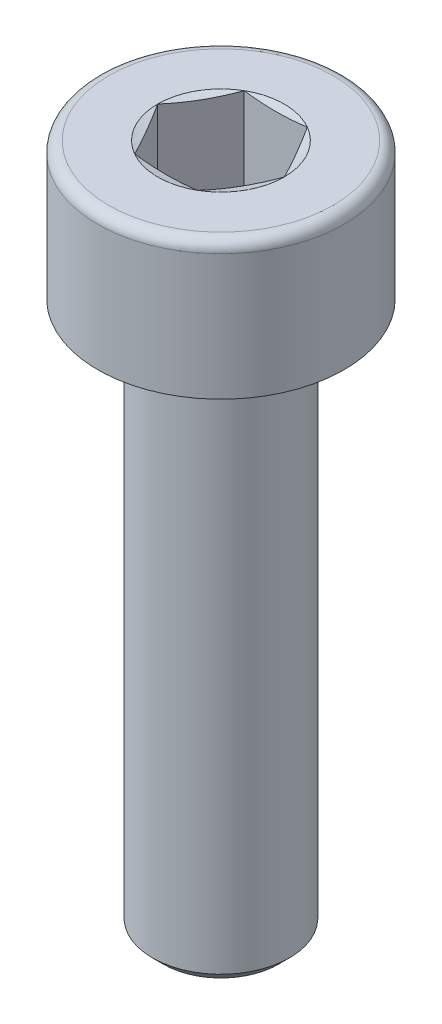
ISO-10303-21;
HEADER;
FILE_DESCRIPTION(('STEP AP214'),'2;1');
FILE_NAME('part.step','',(''),(''),'','','');
FILE_SCHEMA(('AUTOMOTIVE_DESIGN { 1 0 10303 214 1 1 1 1 }'));
ENDSEC;
DATA;
#1=APPLICATION_CONTEXT('core data for automotive mechanical design processes');
#2=APPLICATION_PROTOCOL_DEFINITION('international standard','automotive_design',2000,#1);
#3=PRODUCT_CONTEXT('',#1,'mechanical');
#4=PRODUCT('Part','Part','',(#3));
#5=PRODUCT_RELATED_PRODUCT_CATEGORY('part','',(#4));
#6=PRODUCT_DEFINITION_FORMATION('','',#4);
#7=PRODUCT_DEFINITION_CONTEXT('part definition',#1,'design');
#8=PRODUCT_DEFINITION('design','',#6,#7);
#9=PRODUCT_DEFINITION_SHAPE('','',#8);
#10=(LENGTH_UNIT() NAMED_UNIT(*) SI_UNIT(.MILLI.,.METRE.));
#11=(NAMED_UNIT(*) PLANE_ANGLE_UNIT() SI_UNIT($,.RADIAN.));
#12=(NAMED_UNIT(*) SI_UNIT($,.STERADIAN.) SOLID_ANGLE_UNIT());
#13=UNCERTAINTY_MEASURE_WITH_UNIT(LENGTH_MEASURE(1.E-05),#10,'distance_accuracy_value','');
#14=(GEOMETRIC_REPRESENTATION_CONTEXT(3) GLOBAL_UNCERTAINTY_ASSIGNED_CONTEXT((#13)) GLOBAL_UNIT_ASSIGNED_CONTEXT((#10,
#11,#12)) REPRESENTATION_CONTEXT('',''));
#15=CARTESIAN_POINT('',(0.,0.,0.));
#16=DIRECTION('',(0.,0.,1.));
#17=DIRECTION('',(1.,0.,0.));
#18=AXIS2_PLACEMENT_3D('',#15,#16,#17);
#19=CARTESIAN_POINT('',(-0.577350269189626,0.5,1.));
#20=DIRECTION('',(-0.866025403784439,0.,0.5));
#21=DIRECTION('',(0.5,0.,0.866025403784439));
#22=AXIS2_PLACEMENT_3D('',#19,#20,#21);
#23=PLANE('',#22);
#24=CARTESIAN_POINT('',(-0.577350269189626,2.5,1.));
#25=CARTESIAN_POINT('',(-0.602256905546369,2.4928156948734,0.956860440384478));
#26=CARTESIAN_POINT('',(-0.627233209396661,2.48665993251672,0.913600213130495));
#27=CARTESIAN_POINT('',(-0.677282869012061,2.47629629733561,0.826911659775093));
#28=CARTESIAN_POINT('',(-0.702356208114864,2.47208810385436,0.783483362533635));
#29=CARTESIAN_POINT('',(-0.777414647875531,2.46225168137474,0.653478331331313));
#30=CARTESIAN_POINT('',(-0.827492964204296,2.45934068378329,0.566740143092385));
#31=CARTESIAN_POINT('',(-0.923802752789168,2.46037348534467,0.399926695997169));
#32=CARTESIAN_POINT('',(-0.970035820593886,2.46381057241938,0.319848673569621));
#33=CARTESIAN_POINT('',(-1.03932177179707,2.47367744547349,0.199841885834972));
#34=CARTESIAN_POINT('',(-1.0624605054686,2.47776673103799,0.159764423493068));
#35=CARTESIAN_POINT('',(-1.10865304075022,2.48761182938245,0.0797566054548837));
#36=CARTESIAN_POINT('',(-1.13170682656885,2.49336793760975,0.0398262771102066));
#37=CARTESIAN_POINT('',(-1.15470053837925,2.5,0.));
#38=B_SPLINE_CURVE_WITH_KNOTS('',3,(#24,#25,#26,#27,#28,#29,#30,#31,#32,#33,#34,#35,#36,#37),
.UNSPECIFIED.,.F.,.F.,(4,2,2,2,2,2,4),(0.,0.150960283418929,0.3018957031821,0.602226966634645,
0.879613062899962,1.01895925678016,1.15833016516169),.UNSPECIFIED.);
#39=CARTESIAN_POINT('',(-0.577350269189627,2.5,0.999999999999998));
#40=VERTEX_POINT('',#39);
#41=CARTESIAN_POINT('',(-1.15470053837925,2.5,0.));
#42=VERTEX_POINT('',#41);
#43=EDGE_CURVE('E81',#40,#42,#38,.T.);
#44=ORIENTED_EDGE('',*,*,#43,.F.);
#45=DIRECTION('',(0.,1.,0.));
#46=VECTOR('',#45,1.);
#47=CARTESIAN_POINT('',(-0.577350269189626,0.5,1.));
#48=LINE('',#47,#46);
#49=CARTESIAN_POINT('',(-0.577350269189626,0.5,1.));
#50=VERTEX_POINT('',#49);
#51=EDGE_CURVE('E117',#40,#50,#48,.F.);
#52=ORIENTED_EDGE('',*,*,#51,.T.);
#53=DIRECTION('',(0.5,0.,0.866025403784439));
#54=VECTOR('',#53,1.);
#55=CARTESIAN_POINT('',(-0.577350269189626,0.5,1.));
#56=LINE('',#55,#54);
#57=CARTESIAN_POINT('',(-1.15470053837925,0.5,0.));
#58=VERTEX_POINT('',#57);
#59=EDGE_CURVE('E90',#58,#50,#56,.T.);
#60=ORIENTED_EDGE('',*,*,#59,.F.);
#61=DIRECTION('',(0.,1.,0.));
#62=VECTOR('',#61,1.);
#63=CARTESIAN_POINT('',(-1.15470053837925,0.5,0.));
#64=LINE('',#63,#62);
#65=EDGE_CURVE('E89',#58,#42,#64,.T.);
#66=ORIENTED_EDGE('',*,*,#65,.T.);
#67=EDGE_LOOP('',(#44,#52,#60,#66));
#68=FACE_BOUND('',#67,.T.);
#69=ADVANCED_FACE('F17',(#68),#23,.F.);
#70=CARTESIAN_POINT('',(-1.15470053837925,0.5,0.));
#71=DIRECTION('',(-0.866025403784439,0.,-0.5));
#72=DIRECTION('',(-0.5,0.,0.866025403784439));
#73=AXIS2_PLACEMENT_3D('',#70,#71,#72);
#74=PLANE('',#73);
#75=CARTESIAN_POINT('',(-1.15470053837925,2.5,0.));
#76=CARTESIAN_POINT('',(-1.12979390202251,2.4928156948734,-0.0431395596155221));
#77=CARTESIAN_POINT('',(-1.10481759817222,2.48665993251672,-0.0863997868695051));
#78=CARTESIAN_POINT('',(-1.05476793855682,2.47629629733561,-0.173088340224907));
#79=CARTESIAN_POINT('',(-1.02969459945401,2.47208810385436,-0.216516637466365));
#80=CARTESIAN_POINT('',(-0.954636159693347,2.46225168137474,-0.346521668668687));
#81=CARTESIAN_POINT('',(-0.904557843364581,2.45934068378329,-0.433259856907615));
#82=CARTESIAN_POINT('',(-0.808248054779709,2.46037348534467,-0.600073304002831));
#83=CARTESIAN_POINT('',(-0.762014986974991,2.46381057241938,-0.680151326430379));
#84=CARTESIAN_POINT('',(-0.69272903577181,2.47367744547349,-0.800158114165028));
#85=CARTESIAN_POINT('',(-0.669590302100275,2.47776673103799,-0.840235576506932));
#86=CARTESIAN_POINT('',(-0.623397766818654,2.48761182938245,-0.920243394545116));
#87=CARTESIAN_POINT('',(-0.600343981000025,2.49336793760975,-0.960173722889793));
#88=CARTESIAN_POINT('',(-0.577350269189626,2.5,-1.));
#89=B_SPLINE_CURVE_WITH_KNOTS('',3,(#75,#76,#77,#78,#79,#80,#81,#82,#83,#84,#85,#86,#87,#88),
.UNSPECIFIED.,.F.,.F.,(4,2,2,2,2,2,4),(0.,0.150960283418929,0.301895703182099,0.602226966634645,
0.879613062899962,1.01895925678016,1.15833016516169),.UNSPECIFIED.);
#90=CARTESIAN_POINT('',(-0.577350269189624,2.5,-1.));
#91=VERTEX_POINT('',#90);
#92=EDGE_CURVE('E96',#42,#91,#89,.T.);
#93=ORIENTED_EDGE('',*,*,#92,.F.);
#94=ORIENTED_EDGE('',*,*,#65,.F.);
#95=DIRECTION('',(0.5,0.,-0.866025403784439));
#96=VECTOR('',#95,1.);
#97=CARTESIAN_POINT('',(-1.15470053837925,0.5,0.));
#98=LINE('',#97,#96);
#99=CARTESIAN_POINT('',(-0.577350269189626,0.5,-1.));
#100=VERTEX_POINT('',#99);
#101=EDGE_CURVE('E228',#58,#100,#98,.T.);
#102=ORIENTED_EDGE('',*,*,#101,.T.);
#103=DIRECTION('',(0.,1.,0.));
#104=VECTOR('',#103,1.);
#105=CARTESIAN_POINT('',(-0.577350269189626,0.5,-1.));
#106=LINE('',#105,#104);
#107=EDGE_CURVE('E115',#100,#91,#106,.T.);
#108=ORIENTED_EDGE('',*,*,#107,.T.);
#109=EDGE_LOOP('',(#93,#94,#102,#108));
#110=FACE_BOUND('',#109,.T.);
#111=ADVANCED_FACE('F113',(#110),#74,.F.);
#112=CARTESIAN_POINT('',(0.577350269189626,0.5,1.));
#113=DIRECTION('',(0.,0.,1.));
#114=DIRECTION('',(1.,0.,0.));
#115=AXIS2_PLACEMENT_3D('',#112,#113,#114);
#116=PLANE('',#115);
#117=CARTESIAN_POINT('',(0.577350269189627,2.5,1.));
#118=CARTESIAN_POINT('',(0.52753699647614,2.4928156948734,1.));
#119=CARTESIAN_POINT('',(0.477584388775557,2.48665993251672,1.));
#120=CARTESIAN_POINT('',(0.377485069544756,2.47629629733561,1.));
#121=CARTESIAN_POINT('',(0.32733839133915,2.47208810385436,1.));
#122=CARTESIAN_POINT('',(0.177221511817818,2.46225168137474,1.));
#123=CARTESIAN_POINT('',(0.0770648791602864,2.45934068378329,0.999999999999999));
#124=CARTESIAN_POINT('',(-0.115554698009458,2.46037348534467,0.999999999999999));
#125=CARTESIAN_POINT('',(-0.208020833618895,2.46381057241937,1.));
#126=CARTESIAN_POINT('',(-0.346592736025259,2.47367744547348,1.));
#127=CARTESIAN_POINT('',(-0.392870203368329,2.47776673103799,1.));
#128=CARTESIAN_POINT('',(-0.48525527393157,2.48761182938245,1.));
#129=CARTESIAN_POINT('',(-0.531362845568829,2.49336793760975,1.));
#130=CARTESIAN_POINT('',(-0.577350269189626,2.5,1.));
#131=B_SPLINE_CURVE_WITH_KNOTS('',3,(#117,#118,#119,#120,#121,#122,#123,#124,#125,#126,#127,
#128,#129,#130),.UNSPECIFIED.,.F.,.F.,(4,2,2,2,2,2,4),(0.,0.150960283418929,0.3018957031821,
0.602226966634646,0.879613062899963,1.01895925678016,1.15833016516169),.UNSPECIFIED.);
#132=CARTESIAN_POINT('',(0.577350269189625,2.5,1.));
#133=VERTEX_POINT('',#132);
#134=EDGE_CURVE('E75',#133,#40,#131,.T.);
#135=ORIENTED_EDGE('',*,*,#134,.F.);
#136=DIRECTION('',(0.,1.,0.));
#137=VECTOR('',#136,1.);
#138=CARTESIAN_POINT('',(0.577350269189626,0.5,0.999999999999999));
#139=LINE('',#138,#137);
#140=CARTESIAN_POINT('',(0.577350269189626,0.5,0.999999999999999));
#141=VERTEX_POINT('',#140);
#142=EDGE_CURVE('E211',#133,#141,#139,.F.);
#143=ORIENTED_EDGE('',*,*,#142,.T.);
#144=DIRECTION('',(1.,0.,0.));
#145=VECTOR('',#144,1.);
#146=CARTESIAN_POINT('',(-0.577350269189626,0.5,1.));
#147=LINE('',#146,#145);
#148=EDGE_CURVE('E232',#141,#50,#147,.F.);
#149=ORIENTED_EDGE('',*,*,#148,.T.);
#150=ORIENTED_EDGE('',*,*,#51,.F.);
#151=EDGE_LOOP('',(#135,#143,#149,#150));
#152=FACE_BOUND('',#151,.T.);
#153=ADVANCED_FACE('F138',(#152),#116,.F.);
#154=CARTESIAN_POINT('',(-0.577350269189626,0.5,-1.));
#155=DIRECTION('',(0.,-1.,0.));
#156=DIRECTION('',(0.,0.,-1.));
#157=AXIS2_PLACEMENT_3D('',#154,#155,#156);
#158=PLANE('',#157);
#159=ORIENTED_EDGE('',*,*,#59,.T.);
#160=ORIENTED_EDGE('',*,*,#148,.F.);
#161=DIRECTION('',(0.5,0.,-0.866025403784439));
#162=VECTOR('',#161,1.);
#163=CARTESIAN_POINT('',(1.15470053837925,0.5,0.));
#164=LINE('',#163,#162);
#165=CARTESIAN_POINT('',(1.15470053837925,0.5,0.));
#166=VERTEX_POINT('',#165);
#167=EDGE_CURVE('E160',#141,#166,#164,.T.);
#168=ORIENTED_EDGE('',*,*,#167,.T.);
#169=DIRECTION('',(-0.5,0.,-0.866025403784439));
#170=VECTOR('',#169,1.);
#171=CARTESIAN_POINT('',(0.577350269189626,0.5,-1.));
#172=LINE('',#171,#170);
#173=CARTESIAN_POINT('',(0.577350269189626,0.5,-1.));
#174=VERTEX_POINT('',#173);
#175=EDGE_CURVE('E208',#166,#174,#172,.T.);
#176=ORIENTED_EDGE('',*,*,#175,.T.);
#177=DIRECTION('',(-1.,0.,0.));
#178=VECTOR('',#177,1.);
#179=CARTESIAN_POINT('',(-0.577350269189626,0.5,-1.));
#180=LINE('',#179,#178);
#181=EDGE_CURVE('E223',#174,#100,#180,.T.);
#182=ORIENTED_EDGE('',*,*,#181,.T.);
#183=ORIENTED_EDGE('',*,*,#101,.F.);
#184=EDGE_LOOP('',(#159,#160,#168,#176,#182,#183));
#185=FACE_BOUND('',#184,.T.);
#186=ADVANCED_FACE('F142',(#185),#158,.F.);
#187=CARTESIAN_POINT('',(-0.577350269189626,0.5,-1.));
#188=DIRECTION('',(0.,0.,-1.));
#189=DIRECTION('',(-1.,0.,0.));
#190=AXIS2_PLACEMENT_3D('',#187,#188,#189);
#191=PLANE('',#190);
#192=CARTESIAN_POINT('',(-0.577350269189626,2.5,-1.));
#193=CARTESIAN_POINT('',(-0.527536996476139,2.4928156948734,-1.));
#194=CARTESIAN_POINT('',(-0.477584388775556,2.48665993251672,-1.));
#195=CARTESIAN_POINT('',(-0.377485069544755,2.47629629733561,-1.));
#196=CARTESIAN_POINT('',(-0.327338391339149,2.47208810385436,-1.));
#197=CARTESIAN_POINT('',(-0.177221511817817,2.46225168137474,-1.));
#198=CARTESIAN_POINT('',(-0.0770648791602855,2.45934068378329,-0.999999999999999));
#199=CARTESIAN_POINT('',(0.115554698009459,2.46037348534467,-0.999999999999999));
#200=CARTESIAN_POINT('',(0.208020833618895,2.46381057241937,-1.));
#201=CARTESIAN_POINT('',(0.346592736025259,2.47367744547348,-1.));
#202=CARTESIAN_POINT('',(0.392870203368329,2.47776673103799,-1.));
#203=CARTESIAN_POINT('',(0.48525527393157,2.48761182938245,-1.));
#204=CARTESIAN_POINT('',(0.531362845568829,2.49336793760975,-1.));
#205=CARTESIAN_POINT('',(0.577350269189625,2.5,-1.));
#206=B_SPLINE_CURVE_WITH_KNOTS('',3,(#192,#193,#194,#195,#196,#197,#198,#199,#200,#201,#202,
#203,#204,#205),.UNSPECIFIED.,.F.,.F.,(4,2,2,2,2,2,4),(0.,0.150960283418929,0.3018957031821,
0.602226966634646,0.879613062899963,1.01895925678016,1.15833016516169),.UNSPECIFIED.);
#207=CARTESIAN_POINT('',(0.577350269189625,2.5,-1.));
#208=VERTEX_POINT('',#207);
#209=EDGE_CURVE('E155',#91,#208,#206,.T.);
#210=ORIENTED_EDGE('',*,*,#209,.F.);
#211=ORIENTED_EDGE('',*,*,#107,.F.);
#212=ORIENTED_EDGE('',*,*,#181,.F.);
#213=DIRECTION('',(0.,1.,0.));
#214=VECTOR('',#213,1.);
#215=CARTESIAN_POINT('',(0.577350269189626,0.5,-1.));
#216=LINE('',#215,#214);
#217=EDGE_CURVE('E203',#174,#208,#216,.T.);
#218=ORIENTED_EDGE('',*,*,#217,.T.);
#219=EDGE_LOOP('',(#210,#211,#212,#218));
#220=FACE_BOUND('',#219,.T.);
#221=ADVANCED_FACE('F146',(#220),#191,.F.);
#222=CARTESIAN_POINT('',(1.15470053837925,0.5,0.));
#223=DIRECTION('',(0.866025403784439,0.,0.5));
#224=DIRECTION('',(0.5,0.,-0.866025403784439));
#225=AXIS2_PLACEMENT_3D('',#222,#223,#224);
#226=PLANE('',#225);
#227=CARTESIAN_POINT('',(1.15470053837925,2.5,0.));
#228=CARTESIAN_POINT('',(1.12979390202251,2.4928156948734,0.0431395596155211));
#229=CARTESIAN_POINT('',(1.10481759817222,2.48665993251672,0.0863997868695041));
#230=CARTESIAN_POINT('',(1.05476793855682,2.47629629733561,0.173088340224906));
#231=CARTESIAN_POINT('',(1.02969459945401,2.47208810385436,0.216516637466364));
#232=CARTESIAN_POINT('',(0.954636159693348,2.46225168137474,0.346521668668686));
#233=CARTESIAN_POINT('',(0.904557843364581,2.45934068378329,0.433259856907614));
#234=CARTESIAN_POINT('',(0.808248054779709,2.46037348534467,0.60007330400283));
#235=CARTESIAN_POINT('',(0.762014986974991,2.46381057241937,0.680151326430379));
#236=CARTESIAN_POINT('',(0.69272903577181,2.47367744547348,0.800158114165028));
#237=CARTESIAN_POINT('',(0.669590302100275,2.47776673103799,0.840235576506931));
#238=CARTESIAN_POINT('',(0.623397766818654,2.48761182938245,0.920243394545116));
#239=CARTESIAN_POINT('',(0.600343981000025,2.49336793760975,0.960173722889793));
#240=CARTESIAN_POINT('',(0.577350269189626,2.5,0.999999999999999));
#241=B_SPLINE_CURVE_WITH_KNOTS('',3,(#227,#228,#229,#230,#231,#232,#233,#234,#235,#236,#237,
#238,#239,#240),.UNSPECIFIED.,.F.,.F.,(4,2,2,2,2,2,4),(0.,0.150960283418929,0.3018957031821,
0.602226966634646,0.879613062899963,1.01895925678016,1.15833016516169),.UNSPECIFIED.);
#242=CARTESIAN_POINT('',(1.15470053837925,2.5,0.));
#243=VERTEX_POINT('',#242);
#244=EDGE_CURVE('E161',#243,#133,#241,.T.);
#245=ORIENTED_EDGE('',*,*,#244,.F.);
#246=DIRECTION('',(0.,1.,0.));
#247=VECTOR('',#246,1.);
#248=CARTESIAN_POINT('',(1.15470053837925,0.5,0.));
#249=LINE('',#248,#247);
#250=EDGE_CURVE('E199',#243,#166,#249,.F.);
#251=ORIENTED_EDGE('',*,*,#250,.T.);
#252=ORIENTED_EDGE('',*,*,#167,.F.);
#253=ORIENTED_EDGE('',*,*,#142,.F.);
#254=EDGE_LOOP('',(#245,#251,#252,#253));
#255=FACE_BOUND('',#254,.T.);
#256=ADVANCED_FACE('F151',(#255),#226,.F.);
#257=CARTESIAN_POINT('',(0.577350269189626,0.5,-1.));
#258=DIRECTION('',(0.866025403784439,0.,-0.5));
#259=DIRECTION('',(-0.5,0.,-0.866025403784439));
#260=AXIS2_PLACEMENT_3D('',#257,#258,#259);
#261=PLANE('',#260);
#262=CARTESIAN_POINT('',(1.15470053837925,2.5,0.));
#263=CARTESIAN_POINT('',(1.12979390202251,2.4928156948734,-0.0431395596155228));
#264=CARTESIAN_POINT('',(1.10481759817222,2.48665993251672,-0.0863997868695059));
#265=CARTESIAN_POINT('',(1.05476793855682,2.47629629733561,-0.173088340224908));
#266=CARTESIAN_POINT('',(1.02969459945401,2.47208810385436,-0.216516637466366));
#267=CARTESIAN_POINT('',(0.954636159693346,2.46225168137474,-0.346521668668688));
#268=CARTESIAN_POINT('',(0.904557843364581,2.45934068378329,-0.433259856907616));
#269=CARTESIAN_POINT('',(0.808248054779709,2.46037348534467,-0.600073304002832));
#270=CARTESIAN_POINT('',(0.762014986974991,2.46381057241938,-0.68015132643038));
#271=CARTESIAN_POINT('',(0.692729035771809,2.47367744547349,-0.800158114165029));
#272=CARTESIAN_POINT('',(0.669590302100274,2.47776673103799,-0.840235576506932));
#273=CARTESIAN_POINT('',(0.623397766818654,2.48761182938245,-0.920243394545117));
#274=CARTESIAN_POINT('',(0.600343981000024,2.49336793760975,-0.960173722889794));
#275=CARTESIAN_POINT('',(0.577350269189626,2.5,-1.));
#276=B_SPLINE_CURVE_WITH_KNOTS('',3,(#262,#263,#264,#265,#266,#267,#268,#269,#270,#271,#272,
#273,#274,#275),.UNSPECIFIED.,.F.,.F.,(4,2,2,2,2,2,4),(0.,0.150960283418929,0.3018957031821,
0.602226966634645,0.879613062899962,1.01895925678016,1.15833016516169),.UNSPECIFIED.);
#277=EDGE_CURVE('E202',#243,#208,#276,.T.);
#278=ORIENTED_EDGE('',*,*,#277,.T.);
#279=ORIENTED_EDGE('',*,*,#217,.F.);
#280=ORIENTED_EDGE('',*,*,#175,.F.);
#281=ORIENTED_EDGE('',*,*,#250,.F.);
#282=EDGE_LOOP('',(#278,#279,#280,#281));
#283=FACE_BOUND('',#282,.T.);
#284=ADVANCED_FACE('F194',(#283),#261,.F.);
#285=CARTESIAN_POINT('',(-0.323386652483568,5.38251924939228,0.));
#286=DIRECTION('',(0.,0.,1.));
#287=DIRECTION('',(-1.,0.,0.));
#288=AXIS2_PLACEMENT_3D('',#285,#286,#287);
#289=CIRCLE('',#288,3.);
#290=TRIMMED_CURVE('',#289,(PARAMETER_VALUE(-1.67880173874616)),
(PARAMETER_VALUE(1.67880173874616)),.T.,.PARAMETER.);
#291=CARTESIAN_POINT('',(0.,5.38251924939228,0.));
#292=DIRECTION('',(0.,1.,0.));
#293=AXIS1_PLACEMENT('',#291,#292);
#294=SURFACE_OF_REVOLUTION('',#290,#293);
#295=ORIENTED_EDGE('',*,*,#244,.T.);
#296=CARTESIAN_POINT('',(0.,2.5,0.));
#297=DIRECTION('',(0.,1.,0.));
#298=DIRECTION('',(-1.,0.,0.));
#299=AXIS2_PLACEMENT_3D('',#296,#297,#298);
#300=CIRCLE('',#299,1.15470053837925);
#301=EDGE_CURVE('E259',#243,#133,#300,.F.);
#302=ORIENTED_EDGE('',*,*,#301,.F.);
#303=EDGE_LOOP('',(#295,#302));
#304=FACE_BOUND('',#303,.T.);
#305=ADVANCED_FACE('F191',(#304),#294,.T.);
#306=CARTESIAN_POINT('',(-0.323386652483568,5.38251924939228,0.));
#307=DIRECTION('',(0.,0.,1.));
#308=DIRECTION('',(-1.,0.,0.));
#309=AXIS2_PLACEMENT_3D('',#306,#307,#308);
#310=CIRCLE('',#309,3.);
#311=TRIMMED_CURVE('',#310,(PARAMETER_VALUE(-1.67880173874616)),
(PARAMETER_VALUE(1.67880173874616)),.T.,.PARAMETER.);
#312=CARTESIAN_POINT('',(0.,5.38251924939228,0.));
#313=DIRECTION('',(0.,1.,0.));
#314=AXIS1_PLACEMENT('',#312,#313);
#315=SURFACE_OF_REVOLUTION('',#311,#314);
#316=ORIENTED_EDGE('',*,*,#134,.T.);
#317=CARTESIAN_POINT('',(0.,2.5,0.));
#318=DIRECTION('',(0.,1.,0.));
#319=DIRECTION('',(-1.,0.,0.));
#320=AXIS2_PLACEMENT_3D('',#317,#318,#319);
#321=CIRCLE('',#320,1.15470053837925);
#322=EDGE_CURVE('E106',#133,#40,#321,.F.);
#323=ORIENTED_EDGE('',*,*,#322,.F.);
#324=EDGE_LOOP('',(#316,#323));
#325=FACE_BOUND('',#324,.T.);
#326=ADVANCED_FACE('F188',(#325),#315,.T.);
#327=CARTESIAN_POINT('',(-0.323386652483568,5.38251924939228,0.));
#328=DIRECTION('',(0.,0.,1.));
#329=DIRECTION('',(-1.,0.,0.));
#330=AXIS2_PLACEMENT_3D('',#327,#328,#329);
#331=CIRCLE('',#330,3.);
#332=TRIMMED_CURVE('',#331,(PARAMETER_VALUE(-1.67880173874616)),
(PARAMETER_VALUE(1.67880173874616)),.T.,.PARAMETER.);
#333=CARTESIAN_POINT('',(0.,5.38251924939228,0.));
#334=DIRECTION('',(0.,1.,0.));
#335=AXIS1_PLACEMENT('',#333,#334);
#336=SURFACE_OF_REVOLUTION('',#332,#335);
#337=ORIENTED_EDGE('',*,*,#43,.T.);
#338=CARTESIAN_POINT('',(0.,2.5,0.));
#339=DIRECTION('',(0.,1.,0.));
#340=DIRECTION('',(-1.,0.,0.));
#341=AXIS2_PLACEMENT_3D('',#338,#339,#340);
#342=CIRCLE('',#341,1.15470053837925);
#343=EDGE_CURVE('E85',#40,#42,#342,.F.);
#344=ORIENTED_EDGE('',*,*,#343,.F.);
#345=EDGE_LOOP('',(#337,#344));
#346=FACE_BOUND('',#345,.T.);
#347=ADVANCED_FACE('F83',(#346),#336,.T.);
#348=CARTESIAN_POINT('',(-0.323386652483568,5.38251924939228,0.));
#349=DIRECTION('',(0.,0.,1.));
#350=DIRECTION('',(-1.,0.,0.));
#351=AXIS2_PLACEMENT_3D('',#348,#349,#350);
#352=CIRCLE('',#351,3.);
#353=TRIMMED_CURVE('',#352,(PARAMETER_VALUE(-1.67880173874616)),
(PARAMETER_VALUE(1.67880173874616)),.T.,.PARAMETER.);
#354=CARTESIAN_POINT('',(0.,5.38251924939228,0.));
#355=DIRECTION('',(0.,1.,0.));
#356=AXIS1_PLACEMENT('',#354,#355);
#357=SURFACE_OF_REVOLUTION('',#353,#356);
#358=ORIENTED_EDGE('',*,*,#92,.T.);
#359=CARTESIAN_POINT('',(0.,2.5,0.));
#360=DIRECTION('',(0.,1.,0.));
#361=DIRECTION('',(-1.,0.,0.));
#362=AXIS2_PLACEMENT_3D('',#359,#360,#361);
#363=CIRCLE('',#362,1.15470053837925);
#364=EDGE_CURVE('E103',#42,#91,#363,.F.);
#365=ORIENTED_EDGE('',*,*,#364,.F.);
#366=EDGE_LOOP('',(#358,#365));
#367=FACE_BOUND('',#366,.T.);
#368=ADVANCED_FACE('F109',(#367),#357,.T.);
#369=CARTESIAN_POINT('',(-0.323386652483568,5.38251924939228,0.));
#370=DIRECTION('',(0.,0.,1.));
#371=DIRECTION('',(-1.,0.,0.));
#372=AXIS2_PLACEMENT_3D('',#369,#370,#371);
#373=CIRCLE('',#372,3.);
#374=TRIMMED_CURVE('',#373,(PARAMETER_VALUE(-1.67880173874616)),
(PARAMETER_VALUE(1.67880173874616)),.T.,.PARAMETER.);
#375=CARTESIAN_POINT('',(0.,5.38251924939228,0.));
#376=DIRECTION('',(0.,1.,0.));
#377=AXIS1_PLACEMENT('',#375,#376);
#378=SURFACE_OF_REVOLUTION('',#374,#377);
#379=ORIENTED_EDGE('',*,*,#209,.T.);
#380=CARTESIAN_POINT('',(0.,2.5,0.));
#381=DIRECTION('',(0.,1.,0.));
#382=DIRECTION('',(-1.,0.,0.));
#383=AXIS2_PLACEMENT_3D('',#380,#381,#382);
#384=CIRCLE('',#383,1.15470053837925);
#385=EDGE_CURVE('E111',#91,#208,#384,.F.);
#386=ORIENTED_EDGE('',*,*,#385,.F.);
#387=EDGE_LOOP('',(#379,#386));
#388=FACE_BOUND('',#387,.T.);
#389=ADVANCED_FACE('F167',(#388),#378,.T.);
#390=CARTESIAN_POINT('',(-0.323386652483568,5.38251924939228,0.));
#391=DIRECTION('',(0.,0.,1.));
#392=DIRECTION('',(-1.,0.,0.));
#393=AXIS2_PLACEMENT_3D('',#390,#391,#392);
#394=CIRCLE('',#393,3.);
#395=TRIMMED_CURVE('',#394,(PARAMETER_VALUE(-1.67880173874616)),
(PARAMETER_VALUE(1.67880173874616)),.T.,.PARAMETER.);
#396=CARTESIAN_POINT('',(0.,5.38251924939228,0.));
#397=DIRECTION('',(0.,1.,0.));
#398=AXIS1_PLACEMENT('',#396,#397);
#399=SURFACE_OF_REVOLUTION('',#395,#398);
#400=ORIENTED_EDGE('',*,*,#277,.F.);
#401=CARTESIAN_POINT('',(0.,2.5,0.));
#402=DIRECTION('',(0.,1.,0.));
#403=DIRECTION('',(-1.,0.,0.));
#404=AXIS2_PLACEMENT_3D('',#401,#402,#403);
#405=CIRCLE('',#404,1.15470053837925);
#406=EDGE_CURVE('E254',#208,#243,#405,.F.);
#407=ORIENTED_EDGE('',*,*,#406,.F.);
#408=EDGE_LOOP('',(#400,#407));
#409=FACE_BOUND('',#408,.T.);
#410=ADVANCED_FACE('F172',(#409),#399,.T.);
#411=CARTESIAN_POINT('',(0.,2.5,0.));
#412=DIRECTION('',(0.,1.,0.));
#413=DIRECTION('',(0.,0.,1.));
#414=AXIS2_PLACEMENT_3D('',#411,#412,#413);
#415=PLANE('',#414);
#416=CARTESIAN_POINT('',(0.,2.5,0.));
#417=DIRECTION('',(0.,-1.,0.));
#418=DIRECTION('',(0.,0.,-1.));
#419=AXIS2_PLACEMENT_3D('',#416,#417,#418);
#420=CIRCLE('',#419,2.05);
#421=CARTESIAN_POINT('',(0.,2.5,-2.05));
#422=VERTEX_POINT('',#421);
#423=CARTESIAN_POINT('',(0.,2.5,2.05));
#424=VERTEX_POINT('',#423);
#425=EDGE_CURVE('E37',#422,#424,#420,.T.);
#426=ORIENTED_EDGE('',*,*,#425,.F.);
#427=CARTESIAN_POINT('',(0.,2.5,0.));
#428=DIRECTION('',(0.,-1.,0.));
#429=DIRECTION('',(0.,0.,1.));
#430=AXIS2_PLACEMENT_3D('',#427,#428,#429);
#431=CIRCLE('',#430,2.05);
#432=EDGE_CURVE('E327',#424,#422,#431,.T.);
#433=ORIENTED_EDGE('',*,*,#432,.F.);
#434=EDGE_LOOP('',(#426,#433));
#435=FACE_BOUND('',#434,.T.);
#436=ORIENTED_EDGE('',*,*,#385,.T.);
#437=ORIENTED_EDGE('',*,*,#406,.T.);
#438=ORIENTED_EDGE('',*,*,#301,.T.);
#439=ORIENTED_EDGE('',*,*,#322,.T.);
#440=ORIENTED_EDGE('',*,*,#343,.T.);
#441=ORIENTED_EDGE('',*,*,#364,.T.);
#442=EDGE_LOOP('',(#436,#437,#438,#439,#440,#441));
#443=FACE_BOUND('',#442,.T.);
#444=ADVANCED_FACE('F102',(#435,#443),#415,.T.);
#445=CARTESIAN_POINT('',(0.,2.3,0.));
#446=DIRECTION('',(0.,1.,0.));
#447=DIRECTION('',(0.,0.,1.));
#448=AXIS2_PLACEMENT_3D('',#445,#446,#447);
#449=TOROIDAL_SURFACE('',#448,2.05,0.2);
#450=CARTESIAN_POINT('',(0.,2.3,0.));
#451=DIRECTION('',(0.,-1.,0.));
#452=DIRECTION('',(0.,0.,-1.));
#453=AXIS2_PLACEMENT_3D('',#450,#451,#452);
#454=CIRCLE('',#453,2.25);
#455=CARTESIAN_POINT('',(0.,2.3,-2.25));
#456=VERTEX_POINT('',#455);
#457=EDGE_CURVE('E253',#456,#456,#454,.T.);
#458=ORIENTED_EDGE('',*,*,#457,.F.);
#459=EDGE_LOOP('',(#458));
#460=FACE_BOUND('',#459,.T.);
#461=ORIENTED_EDGE('',*,*,#432,.T.);
#462=ORIENTED_EDGE('',*,*,#425,.T.);
#463=EDGE_LOOP('',(#461,#462));
#464=FACE_BOUND('',#463,.T.);
#465=ADVANCED_FACE('F304',(#460,#464),#449,.T.);
#466=CARTESIAN_POINT('',(0.,-10.,0.));
#467=DIRECTION('',(0.,-1.,0.));
#468=DIRECTION('',(0.,0.,-1.));
#469=AXIS2_PLACEMENT_3D('',#466,#467,#468);
#470=PLANE('',#469);
#471=CARTESIAN_POINT('',(0.,-9.99999999999091,0.));
#472=DIRECTION('',(0.,1.,0.));
#473=DIRECTION('',(0.,0.,1.));
#474=AXIS2_PLACEMENT_3D('',#471,#472,#473);
#475=CIRCLE('',#474,1.05000000007749);
#476=CARTESIAN_POINT('',(0.,-9.99999999999091,1.05000000007749));
#477=VERTEX_POINT('',#476);
#478=EDGE_CURVE('E250',#477,#477,#475,.T.);
#479=ORIENTED_EDGE('',*,*,#478,.F.);
#480=EDGE_LOOP('',(#479));
#481=FACE_BOUND('',#480,.T.);
#482=ADVANCED_FACE('F301',(#481),#470,.T.);
#483=CARTESIAN_POINT('',(0.,2.5,0.));
#484=DIRECTION('',(0.,-1.,0.));
#485=DIRECTION('',(0.,0.,-1.));
#486=AXIS2_PLACEMENT_3D('',#483,#484,#485);
#487=CYLINDRICAL_SURFACE('',#486,2.25);
#488=ORIENTED_EDGE('',*,*,#457,.T.);
#489=EDGE_LOOP('',(#488));
#490=FACE_BOUND('',#489,.T.);
#491=CARTESIAN_POINT('',(0.,0.,0.));
#492=DIRECTION('',(0.,-1.,0.));
#493=DIRECTION('',(0.,0.,-1.));
#494=AXIS2_PLACEMENT_3D('',#491,#492,#493);
#495=CIRCLE('',#494,2.25);
#496=CARTESIAN_POINT('',(0.,0.,-2.25));
#497=VERTEX_POINT('',#496);
#498=EDGE_CURVE('E247',#497,#497,#495,.F.);
#499=ORIENTED_EDGE('',*,*,#498,.T.);
#500=EDGE_LOOP('',(#499));
#501=FACE_BOUND('',#500,.T.);
#502=ADVANCED_FACE('F297',(#490,#501),#487,.T.);
#503=CARTESIAN_POINT('',(0.,-9.80000000004111,0.));
#504=DIRECTION('',(0.,1.,0.));
#505=DIRECTION('',(0.,0.,1.));
#506=AXIS2_PLACEMENT_3D('',#503,#504,#505);
#507=CONICAL_SURFACE('',#506,1.25000000002728,0.785398163397448);
#508=CARTESIAN_POINT('',(0.,-9.8,0.));
#509=DIRECTION('',(0.,1.,0.));
#510=DIRECTION('',(0.,0.,1.));
#511=AXIS2_PLACEMENT_3D('',#508,#509,#510);
#512=CIRCLE('',#511,1.25);
#513=CARTESIAN_POINT('',(0.,-9.8,1.25));
#514=VERTEX_POINT('',#513);
#515=EDGE_CURVE('E29',#514,#514,#512,.T.);
#516=ORIENTED_EDGE('',*,*,#515,.F.);
#517=EDGE_LOOP('',(#516));
#518=FACE_BOUND('',#517,.T.);
#519=ORIENTED_EDGE('',*,*,#478,.T.);
#520=EDGE_LOOP('',(#519));
#521=FACE_BOUND('',#520,.T.);
#522=ADVANCED_FACE('F290',(#518,#521),#507,.T.);
#523=CARTESIAN_POINT('',(0.,0.,0.));
#524=DIRECTION('',(0.,1.,0.));
#525=DIRECTION('',(0.,0.,1.));
#526=AXIS2_PLACEMENT_3D('',#523,#524,#525);
#527=PLANE('',#526);
#528=CARTESIAN_POINT('',(0.,0.,0.));
#529=DIRECTION('',(0.,1.,0.));
#530=DIRECTION('',(0.,0.,1.));
#531=AXIS2_PLACEMENT_3D('',#528,#529,#530);
#532=CIRCLE('',#531,1.25);
#533=CARTESIAN_POINT('',(0.,0.,1.25));
#534=VERTEX_POINT('',#533);
#535=EDGE_CURVE('E11',#534,#534,#532,.F.);
#536=ORIENTED_EDGE('',*,*,#535,.F.);
#537=EDGE_LOOP('',(#536));
#538=FACE_BOUND('',#537,.T.);
#539=ORIENTED_EDGE('',*,*,#498,.F.);
#540=EDGE_LOOP('',(#539));
#541=FACE_BOUND('',#540,.T.);
#542=ADVANCED_FACE('F284',(#538,#541),#527,.F.);
#543=CARTESIAN_POINT('',(0.,-10.,0.));
#544=DIRECTION('',(0.,1.,0.));
#545=DIRECTION('',(0.,0.,1.));
#546=AXIS2_PLACEMENT_3D('',#543,#544,#545);
#547=CYLINDRICAL_SURFACE('',#546,1.25);
#548=ORIENTED_EDGE('',*,*,#535,.T.);
#549=EDGE_LOOP('',(#548));
#550=FACE_BOUND('',#549,.T.);
#551=ORIENTED_EDGE('',*,*,#515,.T.);
#552=EDGE_LOOP('',(#551));
#553=FACE_BOUND('',#552,.T.);
#554=ADVANCED_FACE('F282',(#550,#553),#547,.T.);
#555=CLOSED_SHELL('',(#69,#111,#153,#186,#221,#256,#284,#305,#326,#347,#368,#389,#410,#444,#465,
#482,#502,#522,#542,#554));
#556=MANIFOLD_SOLID_BREP('B1',#555);
#557=ADVANCED_BREP_SHAPE_REPRESENTATION('',(#18,#556),#14);
#558=SHAPE_DEFINITION_REPRESENTATION(#9,#557);
ENDSEC;
END-ISO-10303-21;
